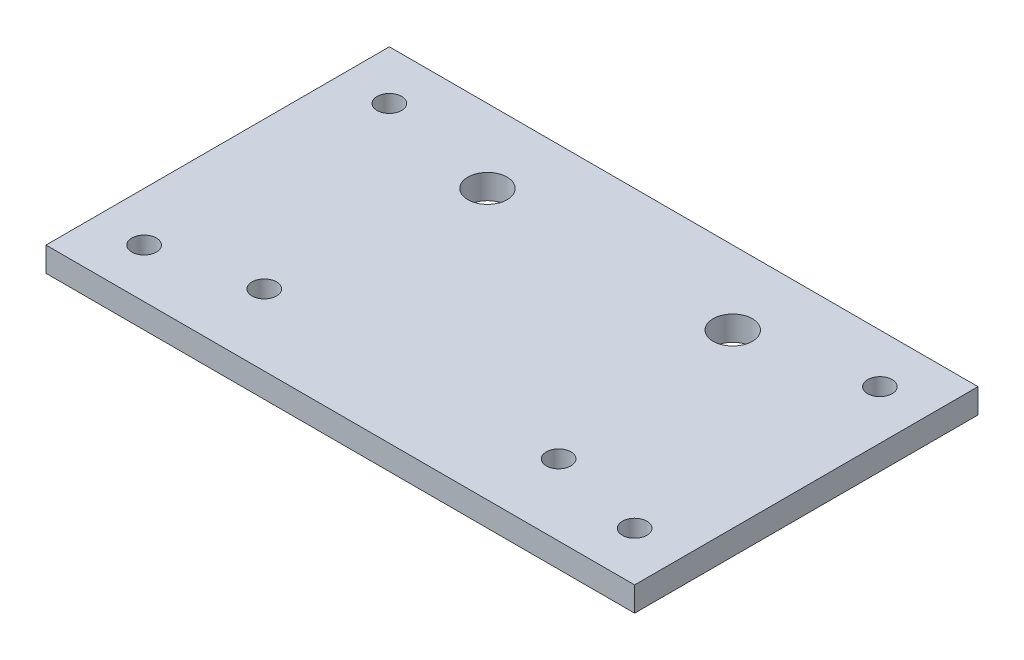
ISO-10303-21;
HEADER;
FILE_DESCRIPTION(('STEP AP214'),'2;1');
FILE_NAME('part.step','',(''),(''),'','','');
FILE_SCHEMA(('AUTOMOTIVE_DESIGN { 1 0 10303 214 1 1 1 1 }'));
ENDSEC;
DATA;
#1=APPLICATION_CONTEXT('core data for automotive mechanical design processes');
#2=APPLICATION_PROTOCOL_DEFINITION('international standard','automotive_design',2000,#1);
#3=PRODUCT_CONTEXT('',#1,'mechanical');
#4=PRODUCT('Part','Part','',(#3));
#5=PRODUCT_RELATED_PRODUCT_CATEGORY('part','',(#4));
#6=PRODUCT_DEFINITION_FORMATION('','',#4);
#7=PRODUCT_DEFINITION_CONTEXT('part definition',#1,'design');
#8=PRODUCT_DEFINITION('design','',#6,#7);
#9=PRODUCT_DEFINITION_SHAPE('','',#8);
#10=(LENGTH_UNIT() NAMED_UNIT(*) SI_UNIT(.MILLI.,.METRE.));
#11=(NAMED_UNIT(*) PLANE_ANGLE_UNIT() SI_UNIT($,.RADIAN.));
#12=(NAMED_UNIT(*) SI_UNIT($,.STERADIAN.) SOLID_ANGLE_UNIT());
#13=UNCERTAINTY_MEASURE_WITH_UNIT(LENGTH_MEASURE(1.E-05),#10,'distance_accuracy_value','');
#14=(GEOMETRIC_REPRESENTATION_CONTEXT(3) GLOBAL_UNCERTAINTY_ASSIGNED_CONTEXT((#13)) GLOBAL_UNIT_ASSIGNED_CONTEXT((#10,
#11,#12)) REPRESENTATION_CONTEXT('',''));
#15=CARTESIAN_POINT('',(0.,0.,0.));
#16=DIRECTION('',(0.,0.,1.));
#17=DIRECTION('',(1.,0.,0.));
#18=AXIS2_PLACEMENT_3D('',#15,#16,#17);
#19=CARTESIAN_POINT('',(0.,5.,0.));
#20=DIRECTION('',(0.,1.,0.));
#21=DIRECTION('',(0.,0.,1.));
#22=AXIS2_PLACEMENT_3D('',#19,#20,#21);
#23=PLANE('',#22);
#24=CARTESIAN_POINT('',(109.999999999995,5.,57.0540098199672));
#25=DIRECTION('',(0.,1.,0.));
#26=DIRECTION('',(0.,0.,1.));
#27=AXIS2_PLACEMENT_3D('',#24,#25,#26);
#28=CIRCLE('',#27,2.50000000000001);
#29=CARTESIAN_POINT('',(109.999999999995,5.,59.5540098199672));
#30=VERTEX_POINT('',#29);
#31=EDGE_CURVE('E145',#30,#30,#28,.T.);
#32=ORIENTED_EDGE('',*,*,#31,.F.);
#33=EDGE_LOOP('',(#32));
#34=FACE_BOUND('',#33,.T.);
#35=CARTESIAN_POINT('',(29.999999999752,5.,52.5540098199558));
#36=DIRECTION('',(0.,1.,0.));
#37=DIRECTION('',(0.,0.,1.));
#38=AXIS2_PLACEMENT_3D('',#35,#36,#37);
#39=CIRCLE('',#38,2.49999999999999);
#40=CARTESIAN_POINT('',(29.999999999752,5.,55.0540098199558));
#41=VERTEX_POINT('',#40);
#42=EDGE_CURVE('E133',#41,#41,#39,.T.);
#43=ORIENTED_EDGE('',*,*,#42,.F.);
#44=EDGE_LOOP('',(#43));
#45=FACE_BOUND('',#44,.T.);
#46=CARTESIAN_POINT('',(9.99999999999469,5.,57.0540098199668));
#47=DIRECTION('',(0.,1.,0.));
#48=DIRECTION('',(0.,0.,1.));
#49=AXIS2_PLACEMENT_3D('',#46,#47,#48);
#50=CIRCLE('',#49,2.5);
#51=CARTESIAN_POINT('',(9.99999999999469,5.,59.5540098199668));
#52=VERTEX_POINT('',#51);
#53=EDGE_CURVE('E121',#52,#52,#50,.T.);
#54=ORIENTED_EDGE('',*,*,#53,.F.);
#55=EDGE_LOOP('',(#54));
#56=FACE_BOUND('',#55,.T.);
#57=CARTESIAN_POINT('',(34.9999999999949,5.,12.0540098199668));
#58=DIRECTION('',(0.,1.,0.));
#59=DIRECTION('',(0.,0.,1.));
#60=AXIS2_PLACEMENT_3D('',#57,#58,#59);
#61=CIRCLE('',#60,3.9999999999999);
#62=CARTESIAN_POINT('',(34.9999999999949,5.,16.0540098199667));
#63=VERTEX_POINT('',#62);
#64=EDGE_CURVE('E100',#63,#63,#61,.T.);
#65=ORIENTED_EDGE('',*,*,#64,.F.);
#66=EDGE_LOOP('',(#65));
#67=FACE_BOUND('',#66,.T.);
#68=DIRECTION('',(0.,0.,1.));
#69=VECTOR('',#68,1.);
#70=CARTESIAN_POINT('',(0.,5.,-2.94599018003273));
#71=LINE('',#70,#69);
#72=CARTESIAN_POINT('',(0.,5.,-2.94599018003273));
#73=VERTEX_POINT('',#72);
#74=CARTESIAN_POINT('',(0.,5.,67.0540098199673));
#75=VERTEX_POINT('',#74);
#76=EDGE_CURVE('E85',#73,#75,#71,.T.);
#77=ORIENTED_EDGE('',*,*,#76,.T.);
#78=DIRECTION('',(1.,0.,0.));
#79=VECTOR('',#78,1.);
#80=CARTESIAN_POINT('',(0.,5.,67.0540098199673));
#81=LINE('',#80,#79);
#82=CARTESIAN_POINT('',(120.,5.,67.0540098199673));
#83=VERTEX_POINT('',#82);
#84=EDGE_CURVE('E80',#75,#83,#81,.T.);
#85=ORIENTED_EDGE('',*,*,#84,.T.);
#86=DIRECTION('',(0.,0.,-1.));
#87=VECTOR('',#86,1.);
#88=CARTESIAN_POINT('',(120.,5.,-2.94599018003273));
#89=LINE('',#88,#87);
#90=CARTESIAN_POINT('',(120.,5.,-2.94599018003273));
#91=VERTEX_POINT('',#90);
#92=EDGE_CURVE('E83',#83,#91,#89,.T.);
#93=ORIENTED_EDGE('',*,*,#92,.T.);
#94=DIRECTION('',(-1.,0.,0.));
#95=VECTOR('',#94,1.);
#96=CARTESIAN_POINT('',(0.,5.,-2.94599018003273));
#97=LINE('',#96,#95);
#98=EDGE_CURVE('E50',#91,#73,#97,.T.);
#99=ORIENTED_EDGE('',*,*,#98,.T.);
#100=EDGE_LOOP('',(#77,#85,#93,#99));
#101=FACE_BOUND('',#100,.T.);
#102=CARTESIAN_POINT('',(84.999999999995,5.,12.0540098199674));
#103=DIRECTION('',(0.,1.,0.));
#104=DIRECTION('',(0.,0.,1.));
#105=AXIS2_PLACEMENT_3D('',#102,#103,#104);
#106=CIRCLE('',#105,4.00000000000001);
#107=CARTESIAN_POINT('',(84.999999999995,5.,16.0540098199674));
#108=VERTEX_POINT('',#107);
#109=EDGE_CURVE('E115',#108,#108,#106,.T.);
#110=ORIENTED_EDGE('',*,*,#109,.F.);
#111=EDGE_LOOP('',(#110));
#112=FACE_BOUND('',#111,.T.);
#113=CARTESIAN_POINT('',(9.99999999999492,5.,7.05400981996682));
#114=DIRECTION('',(0.,1.,0.));
#115=DIRECTION('',(0.,0.,1.));
#116=AXIS2_PLACEMENT_3D('',#113,#114,#115);
#117=CIRCLE('',#116,2.5);
#118=CARTESIAN_POINT('',(9.99999999999492,5.,9.55400981996683));
#119=VERTEX_POINT('',#118);
#120=EDGE_CURVE('E127',#119,#119,#117,.T.);
#121=ORIENTED_EDGE('',*,*,#120,.F.);
#122=EDGE_LOOP('',(#121));
#123=FACE_BOUND('',#122,.T.);
#124=CARTESIAN_POINT('',(89.999999999752,5.,52.554009819956));
#125=DIRECTION('',(0.,1.,0.));
#126=DIRECTION('',(0.,0.,1.));
#127=AXIS2_PLACEMENT_3D('',#124,#125,#126);
#128=CIRCLE('',#127,2.5);
#129=CARTESIAN_POINT('',(89.999999999752,5.,55.054009819956));
#130=VERTEX_POINT('',#129);
#131=EDGE_CURVE('E139',#130,#130,#128,.T.);
#132=ORIENTED_EDGE('',*,*,#131,.F.);
#133=EDGE_LOOP('',(#132));
#134=FACE_BOUND('',#133,.T.);
#135=CARTESIAN_POINT('',(109.999999999995,5.,7.05400981996717));
#136=DIRECTION('',(0.,1.,0.));
#137=DIRECTION('',(0.,0.,1.));
#138=AXIS2_PLACEMENT_3D('',#135,#136,#137);
#139=CIRCLE('',#138,2.50000000000001);
#140=CARTESIAN_POINT('',(109.999999999995,5.,9.55400981996718));
#141=VERTEX_POINT('',#140);
#142=EDGE_CURVE('E151',#141,#141,#139,.T.);
#143=ORIENTED_EDGE('',*,*,#142,.F.);
#144=EDGE_LOOP('',(#143));
#145=FACE_BOUND('',#144,.T.);
#146=ADVANCED_FACE('F33',(#34,#45,#56,#67,#101,#112,#123,#134,#145),#23,.T.);
#147=CARTESIAN_POINT('',(0.,0.,0.));
#148=DIRECTION('',(0.,1.,0.));
#149=DIRECTION('',(0.,0.,1.));
#150=AXIS2_PLACEMENT_3D('',#147,#148,#149);
#151=PLANE('',#150);
#152=DIRECTION('',(0.,0.,1.));
#153=VECTOR('',#152,1.);
#154=CARTESIAN_POINT('',(0.,0.,-2.94599018003273));
#155=LINE('',#154,#153);
#156=CARTESIAN_POINT('',(0.,0.,-2.94599018003273));
#157=VERTEX_POINT('',#156);
#158=CARTESIAN_POINT('',(0.,0.,67.0540098199673));
#159=VERTEX_POINT('',#158);
#160=EDGE_CURVE('E97',#157,#159,#155,.T.);
#161=ORIENTED_EDGE('',*,*,#160,.F.);
#162=DIRECTION('',(-1.,0.,0.));
#163=VECTOR('',#162,1.);
#164=CARTESIAN_POINT('',(0.,0.,-2.94599018003273));
#165=LINE('',#164,#163);
#166=CARTESIAN_POINT('',(120.,0.,-2.94599018003273));
#167=VERTEX_POINT('',#166);
#168=EDGE_CURVE('E73',#167,#157,#165,.T.);
#169=ORIENTED_EDGE('',*,*,#168,.F.);
#170=DIRECTION('',(0.,0.,-1.));
#171=VECTOR('',#170,1.);
#172=CARTESIAN_POINT('',(120.,0.,-2.94599018003273));
#173=LINE('',#172,#171);
#174=CARTESIAN_POINT('',(120.,0.,67.0540098199673));
#175=VERTEX_POINT('',#174);
#176=EDGE_CURVE('E67',#175,#167,#173,.T.);
#177=ORIENTED_EDGE('',*,*,#176,.F.);
#178=DIRECTION('',(1.,0.,0.));
#179=VECTOR('',#178,1.);
#180=CARTESIAN_POINT('',(0.,0.,67.0540098199673));
#181=LINE('',#180,#179);
#182=EDGE_CURVE('E89',#159,#175,#181,.T.);
#183=ORIENTED_EDGE('',*,*,#182,.F.);
#184=EDGE_LOOP('',(#161,#169,#177,#183));
#185=FACE_BOUND('',#184,.T.);
#186=CARTESIAN_POINT('',(34.9999999999949,0.,12.0540098199668));
#187=DIRECTION('',(0.,1.,0.));
#188=DIRECTION('',(0.,0.,1.));
#189=AXIS2_PLACEMENT_3D('',#186,#187,#188);
#190=CIRCLE('',#189,3.9999999999999);
#191=CARTESIAN_POINT('',(34.9999999999949,0.,16.0540098199667));
#192=VERTEX_POINT('',#191);
#193=EDGE_CURVE('E112',#192,#192,#190,.T.);
#194=ORIENTED_EDGE('',*,*,#193,.T.);
#195=EDGE_LOOP('',(#194));
#196=FACE_BOUND('',#195,.T.);
#197=CARTESIAN_POINT('',(84.999999999995,0.,12.0540098199674));
#198=DIRECTION('',(0.,1.,0.));
#199=DIRECTION('',(0.,0.,1.));
#200=AXIS2_PLACEMENT_3D('',#197,#198,#199);
#201=CIRCLE('',#200,4.00000000000001);
#202=CARTESIAN_POINT('',(84.999999999995,0.,16.0540098199674));
#203=VERTEX_POINT('',#202);
#204=EDGE_CURVE('E118',#203,#203,#201,.T.);
#205=ORIENTED_EDGE('',*,*,#204,.T.);
#206=EDGE_LOOP('',(#205));
#207=FACE_BOUND('',#206,.T.);
#208=CARTESIAN_POINT('',(9.99999999999469,0.,57.0540098199668));
#209=DIRECTION('',(0.,1.,0.));
#210=DIRECTION('',(0.,0.,1.));
#211=AXIS2_PLACEMENT_3D('',#208,#209,#210);
#212=CIRCLE('',#211,2.5);
#213=CARTESIAN_POINT('',(9.99999999999469,0.,59.5540098199668));
#214=VERTEX_POINT('',#213);
#215=EDGE_CURVE('E124',#214,#214,#212,.T.);
#216=ORIENTED_EDGE('',*,*,#215,.T.);
#217=EDGE_LOOP('',(#216));
#218=FACE_BOUND('',#217,.T.);
#219=CARTESIAN_POINT('',(9.99999999999492,0.,7.05400981996682));
#220=DIRECTION('',(0.,1.,0.));
#221=DIRECTION('',(0.,0.,1.));
#222=AXIS2_PLACEMENT_3D('',#219,#220,#221);
#223=CIRCLE('',#222,2.5);
#224=CARTESIAN_POINT('',(9.99999999999492,0.,9.55400981996683));
#225=VERTEX_POINT('',#224);
#226=EDGE_CURVE('E130',#225,#225,#223,.T.);
#227=ORIENTED_EDGE('',*,*,#226,.T.);
#228=EDGE_LOOP('',(#227));
#229=FACE_BOUND('',#228,.T.);
#230=CARTESIAN_POINT('',(29.999999999752,0.,52.5540098199558));
#231=DIRECTION('',(0.,1.,0.));
#232=DIRECTION('',(0.,0.,1.));
#233=AXIS2_PLACEMENT_3D('',#230,#231,#232);
#234=CIRCLE('',#233,2.49999999999999);
#235=CARTESIAN_POINT('',(29.999999999752,0.,55.0540098199558));
#236=VERTEX_POINT('',#235);
#237=EDGE_CURVE('E136',#236,#236,#234,.T.);
#238=ORIENTED_EDGE('',*,*,#237,.T.);
#239=EDGE_LOOP('',(#238));
#240=FACE_BOUND('',#239,.T.);
#241=CARTESIAN_POINT('',(89.999999999752,0.,52.554009819956));
#242=DIRECTION('',(0.,1.,0.));
#243=DIRECTION('',(0.,0.,1.));
#244=AXIS2_PLACEMENT_3D('',#241,#242,#243);
#245=CIRCLE('',#244,2.5);
#246=CARTESIAN_POINT('',(89.999999999752,0.,55.054009819956));
#247=VERTEX_POINT('',#246);
#248=EDGE_CURVE('E142',#247,#247,#245,.T.);
#249=ORIENTED_EDGE('',*,*,#248,.T.);
#250=EDGE_LOOP('',(#249));
#251=FACE_BOUND('',#250,.T.);
#252=CARTESIAN_POINT('',(109.999999999995,0.,57.0540098199672));
#253=DIRECTION('',(0.,1.,0.));
#254=DIRECTION('',(0.,0.,1.));
#255=AXIS2_PLACEMENT_3D('',#252,#253,#254);
#256=CIRCLE('',#255,2.50000000000001);
#257=CARTESIAN_POINT('',(109.999999999995,0.,59.5540098199672));
#258=VERTEX_POINT('',#257);
#259=EDGE_CURVE('E148',#258,#258,#256,.T.);
#260=ORIENTED_EDGE('',*,*,#259,.T.);
#261=EDGE_LOOP('',(#260));
#262=FACE_BOUND('',#261,.T.);
#263=CARTESIAN_POINT('',(109.999999999995,0.,7.05400981996717));
#264=DIRECTION('',(0.,1.,0.));
#265=DIRECTION('',(0.,0.,1.));
#266=AXIS2_PLACEMENT_3D('',#263,#264,#265);
#267=CIRCLE('',#266,2.50000000000001);
#268=CARTESIAN_POINT('',(109.999999999995,0.,9.55400981996718));
#269=VERTEX_POINT('',#268);
#270=EDGE_CURVE('E154',#269,#269,#267,.T.);
#271=ORIENTED_EDGE('',*,*,#270,.T.);
#272=EDGE_LOOP('',(#271));
#273=FACE_BOUND('',#272,.T.);
#274=ADVANCED_FACE('F108',(#185,#196,#207,#218,#229,#240,#251,#262,#273),#151,.F.);
#275=CARTESIAN_POINT('',(0.,5.,-2.94599018003273));
#276=DIRECTION('',(1.,0.,0.));
#277=DIRECTION('',(0.,0.,-1.));
#278=AXIS2_PLACEMENT_3D('',#275,#276,#277);
#279=PLANE('',#278);
#280=ORIENTED_EDGE('',*,*,#160,.T.);
#281=DIRECTION('',(0.,-1.,0.));
#282=VECTOR('',#281,1.);
#283=CARTESIAN_POINT('',(0.,5.,67.0540098199673));
#284=LINE('',#283,#282);
#285=EDGE_CURVE('E11',#75,#159,#284,.T.);
#286=ORIENTED_EDGE('',*,*,#285,.F.);
#287=ORIENTED_EDGE('',*,*,#76,.F.);
#288=DIRECTION('',(0.,-1.,0.));
#289=VECTOR('',#288,1.);
#290=CARTESIAN_POINT('',(0.,5.,-2.94599018003273));
#291=LINE('',#290,#289);
#292=EDGE_CURVE('E93',#73,#157,#291,.T.);
#293=ORIENTED_EDGE('',*,*,#292,.T.);
#294=EDGE_LOOP('',(#280,#286,#287,#293));
#295=FACE_BOUND('',#294,.T.);
#296=ADVANCED_FACE('F35',(#295),#279,.F.);
#297=CARTESIAN_POINT('',(0.,5.,67.0540098199673));
#298=DIRECTION('',(0.,0.,-1.));
#299=DIRECTION('',(-1.,0.,0.));
#300=AXIS2_PLACEMENT_3D('',#297,#298,#299);
#301=PLANE('',#300);
#302=ORIENTED_EDGE('',*,*,#182,.T.);
#303=DIRECTION('',(0.,-1.,0.));
#304=VECTOR('',#303,1.);
#305=CARTESIAN_POINT('',(120.,5.,67.0540098199673));
#306=LINE('',#305,#304);
#307=EDGE_CURVE('E42',#83,#175,#306,.T.);
#308=ORIENTED_EDGE('',*,*,#307,.F.);
#309=ORIENTED_EDGE('',*,*,#84,.F.);
#310=ORIENTED_EDGE('',*,*,#285,.T.);
#311=EDGE_LOOP('',(#302,#308,#309,#310));
#312=FACE_BOUND('',#311,.T.);
#313=ADVANCED_FACE('F88',(#312),#301,.F.);
#314=CARTESIAN_POINT('',(120.,5.,-2.94599018003273));
#315=DIRECTION('',(-1.,0.,0.));
#316=DIRECTION('',(0.,0.,1.));
#317=AXIS2_PLACEMENT_3D('',#314,#315,#316);
#318=PLANE('',#317);
#319=ORIENTED_EDGE('',*,*,#176,.T.);
#320=DIRECTION('',(0.,-1.,0.));
#321=VECTOR('',#320,1.);
#322=CARTESIAN_POINT('',(120.,5.,-2.94599018003273));
#323=LINE('',#322,#321);
#324=EDGE_CURVE('E90',#91,#167,#323,.T.);
#325=ORIENTED_EDGE('',*,*,#324,.F.);
#326=ORIENTED_EDGE('',*,*,#92,.F.);
#327=ORIENTED_EDGE('',*,*,#307,.T.);
#328=EDGE_LOOP('',(#319,#325,#326,#327));
#329=FACE_BOUND('',#328,.T.);
#330=ADVANCED_FACE('F91',(#329),#318,.F.);
#331=CARTESIAN_POINT('',(0.,5.,-2.94599018003273));
#332=DIRECTION('',(0.,0.,1.));
#333=DIRECTION('',(1.,0.,0.));
#334=AXIS2_PLACEMENT_3D('',#331,#332,#333);
#335=PLANE('',#334);
#336=ORIENTED_EDGE('',*,*,#168,.T.);
#337=ORIENTED_EDGE('',*,*,#292,.F.);
#338=ORIENTED_EDGE('',*,*,#98,.F.);
#339=ORIENTED_EDGE('',*,*,#324,.T.);
#340=EDGE_LOOP('',(#336,#337,#338,#339));
#341=FACE_BOUND('',#340,.T.);
#342=ADVANCED_FACE('F105',(#341),#335,.F.);
#343=CARTESIAN_POINT('',(34.9999999999949,5.,12.0540098199668));
#344=DIRECTION('',(0.,-1.,0.));
#345=DIRECTION('',(0.,0.,-1.));
#346=AXIS2_PLACEMENT_3D('',#343,#344,#345);
#347=CYLINDRICAL_SURFACE('',#346,3.9999999999999);
#348=ORIENTED_EDGE('',*,*,#64,.T.);
#349=EDGE_LOOP('',(#348));
#350=FACE_BOUND('',#349,.T.);
#351=ORIENTED_EDGE('',*,*,#193,.F.);
#352=EDGE_LOOP('',(#351));
#353=FACE_BOUND('',#352,.T.);
#354=ADVANCED_FACE('F173',(#350,#353),#347,.F.);
#355=CARTESIAN_POINT('',(84.999999999995,5.,12.0540098199674));
#356=DIRECTION('',(0.,-1.,0.));
#357=DIRECTION('',(0.,0.,-1.));
#358=AXIS2_PLACEMENT_3D('',#355,#356,#357);
#359=CYLINDRICAL_SURFACE('',#358,4.00000000000001);
#360=ORIENTED_EDGE('',*,*,#109,.T.);
#361=EDGE_LOOP('',(#360));
#362=FACE_BOUND('',#361,.T.);
#363=ORIENTED_EDGE('',*,*,#204,.F.);
#364=EDGE_LOOP('',(#363));
#365=FACE_BOUND('',#364,.T.);
#366=ADVANCED_FACE('F219',(#362,#365),#359,.F.);
#367=CARTESIAN_POINT('',(9.99999999999469,5.,57.0540098199668));
#368=DIRECTION('',(0.,-1.,0.));
#369=DIRECTION('',(0.,0.,-1.));
#370=AXIS2_PLACEMENT_3D('',#367,#368,#369);
#371=CYLINDRICAL_SURFACE('',#370,2.5);
#372=ORIENTED_EDGE('',*,*,#53,.T.);
#373=EDGE_LOOP('',(#372));
#374=FACE_BOUND('',#373,.T.);
#375=ORIENTED_EDGE('',*,*,#215,.F.);
#376=EDGE_LOOP('',(#375));
#377=FACE_BOUND('',#376,.T.);
#378=ADVANCED_FACE('F227',(#374,#377),#371,.F.);
#379=CARTESIAN_POINT('',(9.99999999999492,5.,7.05400981996682));
#380=DIRECTION('',(0.,-1.,0.));
#381=DIRECTION('',(0.,0.,-1.));
#382=AXIS2_PLACEMENT_3D('',#379,#380,#381);
#383=CYLINDRICAL_SURFACE('',#382,2.5);
#384=ORIENTED_EDGE('',*,*,#120,.T.);
#385=EDGE_LOOP('',(#384));
#386=FACE_BOUND('',#385,.T.);
#387=ORIENTED_EDGE('',*,*,#226,.F.);
#388=EDGE_LOOP('',(#387));
#389=FACE_BOUND('',#388,.T.);
#390=ADVANCED_FACE('F235',(#386,#389),#383,.F.);
#391=CARTESIAN_POINT('',(29.999999999752,5.,52.5540098199558));
#392=DIRECTION('',(0.,-1.,0.));
#393=DIRECTION('',(0.,0.,-1.));
#394=AXIS2_PLACEMENT_3D('',#391,#392,#393);
#395=CYLINDRICAL_SURFACE('',#394,2.49999999999999);
#396=ORIENTED_EDGE('',*,*,#42,.T.);
#397=EDGE_LOOP('',(#396));
#398=FACE_BOUND('',#397,.T.);
#399=ORIENTED_EDGE('',*,*,#237,.F.);
#400=EDGE_LOOP('',(#399));
#401=FACE_BOUND('',#400,.T.);
#402=ADVANCED_FACE('F244',(#398,#401),#395,.F.);
#403=CARTESIAN_POINT('',(89.999999999752,5.,52.554009819956));
#404=DIRECTION('',(0.,-1.,0.));
#405=DIRECTION('',(0.,0.,-1.));
#406=AXIS2_PLACEMENT_3D('',#403,#404,#405);
#407=CYLINDRICAL_SURFACE('',#406,2.5);
#408=ORIENTED_EDGE('',*,*,#131,.T.);
#409=EDGE_LOOP('',(#408));
#410=FACE_BOUND('',#409,.T.);
#411=ORIENTED_EDGE('',*,*,#248,.F.);
#412=EDGE_LOOP('',(#411));
#413=FACE_BOUND('',#412,.T.);
#414=ADVANCED_FACE('F253',(#410,#413),#407,.F.);
#415=CARTESIAN_POINT('',(109.999999999995,5.,57.0540098199672));
#416=DIRECTION('',(0.,-1.,0.));
#417=DIRECTION('',(0.,0.,-1.));
#418=AXIS2_PLACEMENT_3D('',#415,#416,#417);
#419=CYLINDRICAL_SURFACE('',#418,2.50000000000001);
#420=ORIENTED_EDGE('',*,*,#31,.T.);
#421=EDGE_LOOP('',(#420));
#422=FACE_BOUND('',#421,.T.);
#423=ORIENTED_EDGE('',*,*,#259,.F.);
#424=EDGE_LOOP('',(#423));
#425=FACE_BOUND('',#424,.T.);
#426=ADVANCED_FACE('F262',(#422,#425),#419,.F.);
#427=CARTESIAN_POINT('',(109.999999999995,5.,7.05400981996717));
#428=DIRECTION('',(0.,-1.,0.));
#429=DIRECTION('',(0.,0.,-1.));
#430=AXIS2_PLACEMENT_3D('',#427,#428,#429);
#431=CYLINDRICAL_SURFACE('',#430,2.50000000000001);
#432=ORIENTED_EDGE('',*,*,#142,.T.);
#433=EDGE_LOOP('',(#432));
#434=FACE_BOUND('',#433,.T.);
#435=ORIENTED_EDGE('',*,*,#270,.F.);
#436=EDGE_LOOP('',(#435));
#437=FACE_BOUND('',#436,.T.);
#438=ADVANCED_FACE('F160',(#434,#437),#431,.F.);
#439=CLOSED_SHELL('',(#146,#274,#296,#313,#330,#342,#354,#366,#378,#390,#402,#414,#426,#438));
#440=MANIFOLD_SOLID_BREP('B2',#439);
#441=ADVANCED_BREP_SHAPE_REPRESENTATION('',(#18,#440),#14);
#442=SHAPE_DEFINITION_REPRESENTATION(#9,#441);
ENDSEC;
END-ISO-10303-21;
